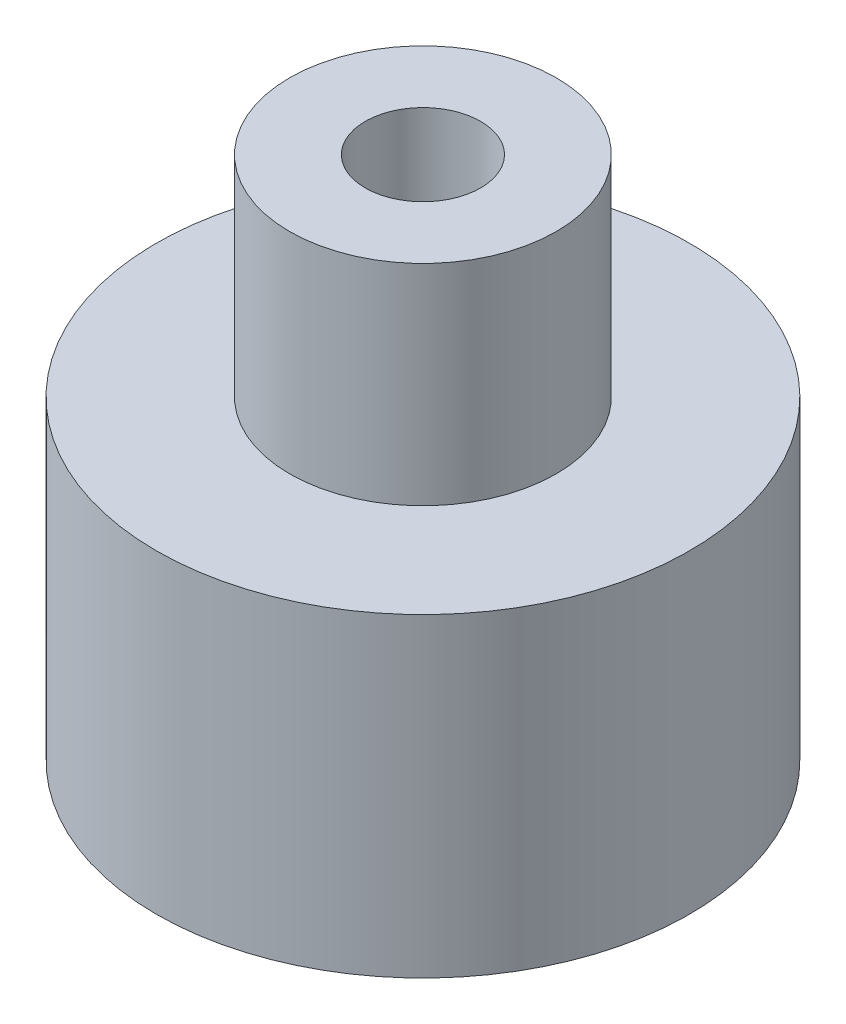
ISO-10303-21;
HEADER;
FILE_DESCRIPTION(('STEP AP214'),'2;1');
FILE_NAME('part.step','',(''),(''),'','','');
FILE_SCHEMA(('AUTOMOTIVE_DESIGN { 1 0 10303 214 1 1 1 1 }'));
ENDSEC;
DATA;
#1=APPLICATION_CONTEXT('core data for automotive mechanical design processes');
#2=APPLICATION_PROTOCOL_DEFINITION('international standard','automotive_design',2000,#1);
#3=PRODUCT_CONTEXT('',#1,'mechanical');
#4=PRODUCT('Part','Part','',(#3));
#5=PRODUCT_RELATED_PRODUCT_CATEGORY('part','',(#4));
#6=PRODUCT_DEFINITION_FORMATION('','',#4);
#7=PRODUCT_DEFINITION_CONTEXT('part definition',#1,'design');
#8=PRODUCT_DEFINITION('design','',#6,#7);
#9=PRODUCT_DEFINITION_SHAPE('','',#8);
#10=(LENGTH_UNIT() NAMED_UNIT(*) SI_UNIT(.MILLI.,.METRE.));
#11=(NAMED_UNIT(*) PLANE_ANGLE_UNIT() SI_UNIT($,.RADIAN.));
#12=(NAMED_UNIT(*) SI_UNIT($,.STERADIAN.) SOLID_ANGLE_UNIT());
#13=UNCERTAINTY_MEASURE_WITH_UNIT(LENGTH_MEASURE(1.E-05),#10,'distance_accuracy_value','');
#14=(GEOMETRIC_REPRESENTATION_CONTEXT(3) GLOBAL_UNCERTAINTY_ASSIGNED_CONTEXT((#13)) GLOBAL_UNIT_ASSIGNED_CONTEXT((#10,
#11,#12)) REPRESENTATION_CONTEXT('',''));
#15=CARTESIAN_POINT('',(0.,0.,0.));
#16=DIRECTION('',(0.,0.,1.));
#17=DIRECTION('',(1.,0.,0.));
#18=AXIS2_PLACEMENT_3D('',#15,#16,#17);
#19=CARTESIAN_POINT('',(12.7,50.,0.));
#20=DIRECTION('',(0.,-1.,0.));
#21=DIRECTION('',(0.,0.,-1.));
#22=AXIS2_PLACEMENT_3D('',#19,#20,#21);
#23=PLANE('',#22);
#24=CARTESIAN_POINT('',(0.,50.,0.));
#25=DIRECTION('',(0.,1.,0.));
#26=DIRECTION('',(0.,0.,1.));
#27=AXIS2_PLACEMENT_3D('',#24,#25,#26);
#28=CIRCLE('',#27,5.5);
#29=CARTESIAN_POINT('',(0.,50.,5.5));
#30=VERTEX_POINT('',#29);
#31=EDGE_CURVE('E59',#30,#30,#28,.T.);
#32=ORIENTED_EDGE('',*,*,#31,.F.);
#33=EDGE_LOOP('',(#32));
#34=FACE_BOUND('',#33,.T.);
#35=CARTESIAN_POINT('',(0.,50.,0.));
#36=DIRECTION('',(0.,1.,0.));
#37=DIRECTION('',(0.,0.,1.));
#38=AXIS2_PLACEMENT_3D('',#35,#36,#37);
#39=CIRCLE('',#38,12.7);
#40=CARTESIAN_POINT('',(0.,50.,12.7));
#41=VERTEX_POINT('',#40);
#42=EDGE_CURVE('E45',#41,#41,#39,.T.);
#43=ORIENTED_EDGE('',*,*,#42,.T.);
#44=EDGE_LOOP('',(#43));
#45=FACE_BOUND('',#44,.T.);
#46=ADVANCED_FACE('F31',(#34,#45),#23,.F.);
#47=CARTESIAN_POINT('',(0.,0.,0.));
#48=DIRECTION('',(0.,1.,0.));
#49=DIRECTION('',(0.,0.,1.));
#50=AXIS2_PLACEMENT_3D('',#47,#48,#49);
#51=PLANE('',#50);
#52=CARTESIAN_POINT('',(0.,0.,0.));
#53=DIRECTION('',(0.,1.,0.));
#54=DIRECTION('',(0.,0.,1.));
#55=AXIS2_PLACEMENT_3D('',#52,#53,#54);
#56=CIRCLE('',#55,3.29999999999998);
#57=CARTESIAN_POINT('',(0.,0.,3.29999999999998));
#58=VERTEX_POINT('',#57);
#59=EDGE_CURVE('E50',#58,#58,#56,.T.);
#60=ORIENTED_EDGE('',*,*,#59,.T.);
#61=EDGE_LOOP('',(#60));
#62=FACE_BOUND('',#61,.T.);
#63=CARTESIAN_POINT('',(0.,0.,0.));
#64=DIRECTION('',(0.,1.,0.));
#65=DIRECTION('',(0.,0.,1.));
#66=AXIS2_PLACEMENT_3D('',#63,#64,#65);
#67=CIRCLE('',#66,25.4);
#68=CARTESIAN_POINT('',(0.,0.,25.4));
#69=VERTEX_POINT('',#68);
#70=EDGE_CURVE('E10',#69,#69,#67,.T.);
#71=ORIENTED_EDGE('',*,*,#70,.F.);
#72=EDGE_LOOP('',(#71));
#73=FACE_BOUND('',#72,.T.);
#74=ADVANCED_FACE('F67',(#62,#73),#51,.F.);
#75=CARTESIAN_POINT('',(0.,50.,0.));
#76=DIRECTION('',(0.,1.,0.));
#77=DIRECTION('',(0.,0.,1.));
#78=AXIS2_PLACEMENT_3D('',#75,#76,#77);
#79=CYLINDRICAL_SURFACE('',#78,25.4);
#80=CARTESIAN_POINT('',(0.,30.,0.));
#81=DIRECTION('',(0.,1.,0.));
#82=DIRECTION('',(0.,0.,1.));
#83=AXIS2_PLACEMENT_3D('',#80,#81,#82);
#84=CIRCLE('',#83,25.4);
#85=CARTESIAN_POINT('',(0.,30.,25.4));
#86=VERTEX_POINT('',#85);
#87=EDGE_CURVE('E37',#86,#86,#84,.T.);
#88=ORIENTED_EDGE('',*,*,#87,.F.);
#89=EDGE_LOOP('',(#88));
#90=FACE_BOUND('',#89,.T.);
#91=ORIENTED_EDGE('',*,*,#70,.T.);
#92=EDGE_LOOP('',(#91));
#93=FACE_BOUND('',#92,.T.);
#94=ADVANCED_FACE('F79',(#90,#93),#79,.T.);
#95=CARTESIAN_POINT('',(25.4,30.,0.));
#96=DIRECTION('',(0.,-1.,0.));
#97=DIRECTION('',(0.,0.,-1.));
#98=AXIS2_PLACEMENT_3D('',#95,#96,#97);
#99=PLANE('',#98);
#100=CARTESIAN_POINT('',(0.,30.,0.));
#101=DIRECTION('',(0.,1.,0.));
#102=DIRECTION('',(0.,0.,1.));
#103=AXIS2_PLACEMENT_3D('',#100,#101,#102);
#104=CIRCLE('',#103,12.7);
#105=CARTESIAN_POINT('',(0.,30.,12.7));
#106=VERTEX_POINT('',#105);
#107=EDGE_CURVE('E41',#106,#106,#104,.T.);
#108=ORIENTED_EDGE('',*,*,#107,.F.);
#109=EDGE_LOOP('',(#108));
#110=FACE_BOUND('',#109,.T.);
#111=ORIENTED_EDGE('',*,*,#87,.T.);
#112=EDGE_LOOP('',(#111));
#113=FACE_BOUND('',#112,.T.);
#114=ADVANCED_FACE('F74',(#110,#113),#99,.F.);
#115=CARTESIAN_POINT('',(0.,50.,0.));
#116=DIRECTION('',(0.,1.,0.));
#117=DIRECTION('',(0.,0.,1.));
#118=AXIS2_PLACEMENT_3D('',#115,#116,#117);
#119=CYLINDRICAL_SURFACE('',#118,12.7);
#120=ORIENTED_EDGE('',*,*,#42,.F.);
#121=EDGE_LOOP('',(#120));
#122=FACE_BOUND('',#121,.T.);
#123=ORIENTED_EDGE('',*,*,#107,.T.);
#124=EDGE_LOOP('',(#123));
#125=FACE_BOUND('',#124,.T.);
#126=ADVANCED_FACE('F70',(#122,#125),#119,.T.);
#127=CARTESIAN_POINT('',(0.,50.,0.));
#128=DIRECTION('',(0.,1.,0.));
#129=DIRECTION('',(0.,0.,1.));
#130=AXIS2_PLACEMENT_3D('',#127,#128,#129);
#131=CYLINDRICAL_SURFACE('',#130,3.29999999999999);
#132=ORIENTED_EDGE('',*,*,#59,.F.);
#133=EDGE_LOOP('',(#132));
#134=FACE_BOUND('',#133,.T.);
#135=CARTESIAN_POINT('',(0.,13.6,0.));
#136=DIRECTION('',(0.,1.,0.));
#137=DIRECTION('',(0.,0.,1.));
#138=AXIS2_PLACEMENT_3D('',#135,#136,#137);
#139=CIRCLE('',#138,3.29999999999999);
#140=CARTESIAN_POINT('',(0.,13.6,3.29999999999999));
#141=VERTEX_POINT('',#140);
#142=EDGE_CURVE('E53',#141,#141,#139,.T.);
#143=ORIENTED_EDGE('',*,*,#142,.T.);
#144=EDGE_LOOP('',(#143));
#145=FACE_BOUND('',#144,.T.);
#146=ADVANCED_FACE('F73',(#134,#145),#131,.F.);
#147=CARTESIAN_POINT('',(3.29999999999999,13.6,0.));
#148=DIRECTION('',(0.,-1.,0.));
#149=DIRECTION('',(0.,0.,-1.));
#150=AXIS2_PLACEMENT_3D('',#147,#148,#149);
#151=PLANE('',#150);
#152=ORIENTED_EDGE('',*,*,#142,.F.);
#153=EDGE_LOOP('',(#152));
#154=FACE_BOUND('',#153,.T.);
#155=CARTESIAN_POINT('',(0.,13.6,0.));
#156=DIRECTION('',(0.,1.,0.));
#157=DIRECTION('',(0.,0.,1.));
#158=AXIS2_PLACEMENT_3D('',#155,#156,#157);
#159=CIRCLE('',#158,5.49999999999999);
#160=CARTESIAN_POINT('',(0.,13.6,5.49999999999999));
#161=VERTEX_POINT('',#160);
#162=EDGE_CURVE('E56',#161,#161,#159,.T.);
#163=ORIENTED_EDGE('',*,*,#162,.T.);
#164=EDGE_LOOP('',(#163));
#165=FACE_BOUND('',#164,.T.);
#166=ADVANCED_FACE('F97',(#154,#165),#151,.F.);
#167=CARTESIAN_POINT('',(0.,50.,0.));
#168=DIRECTION('',(0.,1.,0.));
#169=DIRECTION('',(0.,0.,1.));
#170=AXIS2_PLACEMENT_3D('',#167,#168,#169);
#171=CYLINDRICAL_SURFACE('',#170,5.5);
#172=ORIENTED_EDGE('',*,*,#162,.F.);
#173=EDGE_LOOP('',(#172));
#174=FACE_BOUND('',#173,.T.);
#175=ORIENTED_EDGE('',*,*,#31,.T.);
#176=EDGE_LOOP('',(#175));
#177=FACE_BOUND('',#176,.T.);
#178=ADVANCED_FACE('F63',(#174,#177),#171,.F.);
#179=CLOSED_SHELL('',(#46,#74,#94,#114,#126,#146,#166,#178));
#180=MANIFOLD_SOLID_BREP('B2',#179);
#181=ADVANCED_BREP_SHAPE_REPRESENTATION('',(#18,#180),#14);
#182=SHAPE_DEFINITION_REPRESENTATION(#9,#181);
ENDSEC;
END-ISO-10303-21;
